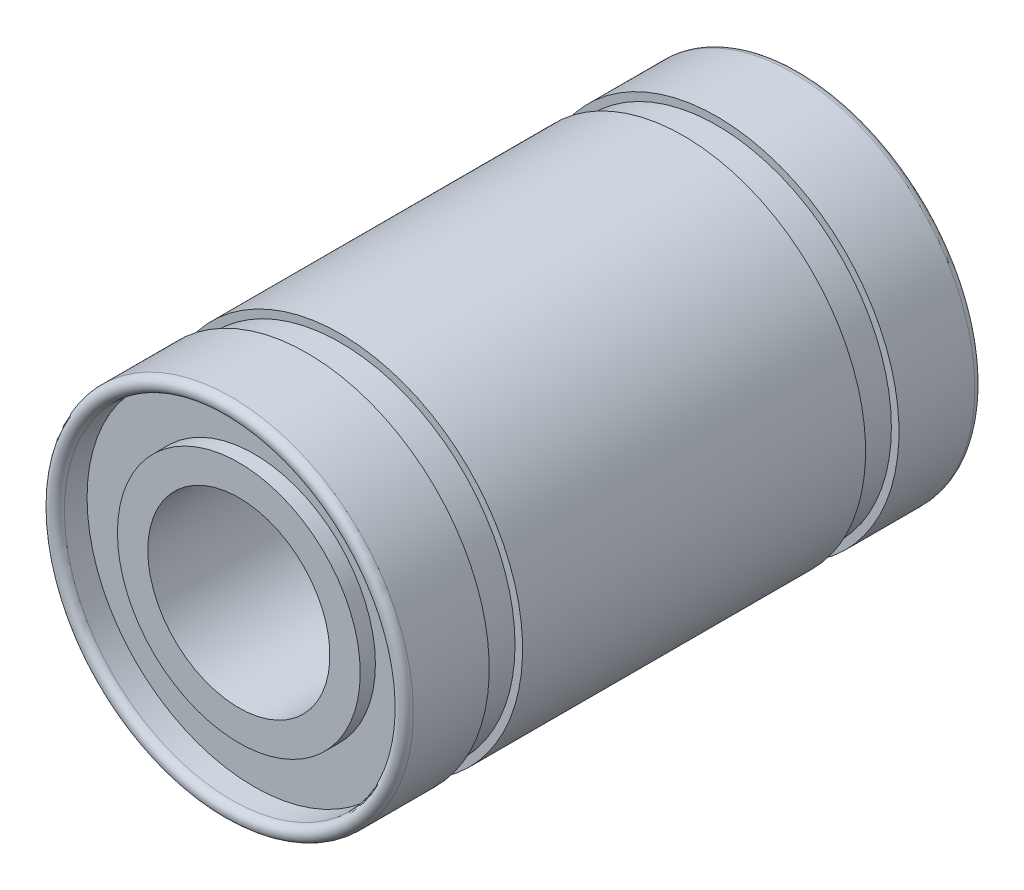
ISO-10303-21;
HEADER;
FILE_DESCRIPTION(('STEP AP214'),'2;1');
FILE_NAME('part.step','',(''),(''),'','','');
FILE_SCHEMA(('AUTOMOTIVE_DESIGN { 1 0 10303 214 1 1 1 1 }'));
ENDSEC;
DATA;
#1=APPLICATION_CONTEXT('core data for automotive mechanical design processes');
#2=APPLICATION_PROTOCOL_DEFINITION('international standard','automotive_design',2000,#1);
#3=PRODUCT_CONTEXT('',#1,'mechanical');
#4=PRODUCT('Part','Part','',(#3));
#5=PRODUCT_RELATED_PRODUCT_CATEGORY('part','',(#4));
#6=PRODUCT_DEFINITION_FORMATION('','',#4);
#7=PRODUCT_DEFINITION_CONTEXT('part definition',#1,'design');
#8=PRODUCT_DEFINITION('design','',#6,#7);
#9=PRODUCT_DEFINITION_SHAPE('','',#8);
#10=(LENGTH_UNIT() NAMED_UNIT(*) SI_UNIT(.MILLI.,.METRE.));
#11=(NAMED_UNIT(*) PLANE_ANGLE_UNIT() SI_UNIT($,.RADIAN.));
#12=(NAMED_UNIT(*) SI_UNIT($,.STERADIAN.) SOLID_ANGLE_UNIT());
#13=UNCERTAINTY_MEASURE_WITH_UNIT(LENGTH_MEASURE(1.E-05),#10,'distance_accuracy_value','');
#14=(GEOMETRIC_REPRESENTATION_CONTEXT(3) GLOBAL_UNCERTAINTY_ASSIGNED_CONTEXT((#13)) GLOBAL_UNIT_ASSIGNED_CONTEXT((#10,
#11,#12)) REPRESENTATION_CONTEXT('',''));
#15=CARTESIAN_POINT('',(0.,0.,0.));
#16=DIRECTION('',(0.,0.,1.));
#17=DIRECTION('',(1.,0.,0.));
#18=AXIS2_PLACEMENT_3D('',#15,#16,#17);
#19=CARTESIAN_POINT('',(0.,0.,18.5));
#20=DIRECTION('',(0.,0.,-1.));
#21=DIRECTION('',(-1.,0.,0.));
#22=AXIS2_PLACEMENT_3D('',#19,#20,#21);
#23=CYLINDRICAL_SURFACE('',#22,3.);
#24=CARTESIAN_POINT('',(0.,0.,0.5));
#25=DIRECTION('',(0.,0.,-1.));
#26=DIRECTION('',(-1.,0.,0.));
#27=AXIS2_PLACEMENT_3D('',#24,#25,#26);
#28=CIRCLE('',#27,3.);
#29=CARTESIAN_POINT('',(-3.,0.,0.5));
#30=VERTEX_POINT('',#29);
#31=EDGE_CURVE('E68',#30,#30,#28,.T.);
#32=ORIENTED_EDGE('',*,*,#31,.T.);
#33=EDGE_LOOP('',(#32));
#34=FACE_BOUND('',#33,.T.);
#35=CARTESIAN_POINT('',(0.,0.,18.5));
#36=DIRECTION('',(0.,0.,-1.));
#37=DIRECTION('',(-1.,0.,0.));
#38=AXIS2_PLACEMENT_3D('',#35,#36,#37);
#39=CIRCLE('',#38,3.);
#40=CARTESIAN_POINT('',(-3.,0.,18.5));
#41=VERTEX_POINT('',#40);
#42=EDGE_CURVE('E18',#41,#41,#39,.T.);
#43=ORIENTED_EDGE('',*,*,#42,.F.);
#44=EDGE_LOOP('',(#43));
#45=FACE_BOUND('',#44,.T.);
#46=ADVANCED_FACE('F15',(#34,#45),#23,.F.);
#47=CARTESIAN_POINT('',(0.,0.,18.5));
#48=DIRECTION('',(0.,0.,1.));
#49=DIRECTION('',(1.,0.,0.));
#50=AXIS2_PLACEMENT_3D('',#47,#48,#49);
#51=PLANE('',#50);
#52=CARTESIAN_POINT('',(0.,0.,18.5));
#53=DIRECTION('',(0.,0.,-1.));
#54=DIRECTION('',(-1.,0.,0.));
#55=AXIS2_PLACEMENT_3D('',#52,#53,#54);
#56=CIRCLE('',#55,4.);
#57=CARTESIAN_POINT('',(-4.,0.,18.5));
#58=VERTEX_POINT('',#57);
#59=EDGE_CURVE('E66',#58,#58,#56,.T.);
#60=ORIENTED_EDGE('',*,*,#59,.F.);
#61=EDGE_LOOP('',(#60));
#62=FACE_BOUND('',#61,.T.);
#63=ORIENTED_EDGE('',*,*,#42,.T.);
#64=EDGE_LOOP('',(#63));
#65=FACE_BOUND('',#64,.T.);
#66=ADVANCED_FACE('F75',(#62,#65),#51,.T.);
#67=CARTESIAN_POINT('',(0.,0.,0.5));
#68=DIRECTION('',(0.,0.,1.));
#69=DIRECTION('',(1.,0.,0.));
#70=AXIS2_PLACEMENT_3D('',#67,#68,#69);
#71=PLANE('',#70);
#72=CARTESIAN_POINT('',(0.,0.,0.5));
#73=DIRECTION('',(0.,0.,-1.));
#74=DIRECTION('',(-1.,0.,0.));
#75=AXIS2_PLACEMENT_3D('',#72,#73,#74);
#76=CIRCLE('',#75,4.);
#77=CARTESIAN_POINT('',(-4.,0.,0.5));
#78=VERTEX_POINT('',#77);
#79=EDGE_CURVE('E63',#78,#78,#76,.F.);
#80=ORIENTED_EDGE('',*,*,#79,.F.);
#81=EDGE_LOOP('',(#80));
#82=FACE_BOUND('',#81,.T.);
#83=ORIENTED_EDGE('',*,*,#31,.F.);
#84=EDGE_LOOP('',(#83));
#85=FACE_BOUND('',#84,.T.);
#86=ADVANCED_FACE('F82',(#82,#85),#71,.F.);
#87=CARTESIAN_POINT('',(0.,0.,18.5));
#88=DIRECTION('',(0.,0.,-1.));
#89=DIRECTION('',(-1.,0.,0.));
#90=AXIS2_PLACEMENT_3D('',#87,#88,#89);
#91=CYLINDRICAL_SURFACE('',#90,4.);
#92=ORIENTED_EDGE('',*,*,#59,.T.);
#93=EDGE_LOOP('',(#92));
#94=FACE_BOUND('',#93,.T.);
#95=CARTESIAN_POINT('',(0.,0.,18.));
#96=DIRECTION('',(0.,0.,-1.));
#97=DIRECTION('',(-1.,0.,0.));
#98=AXIS2_PLACEMENT_3D('',#95,#96,#97);
#99=CIRCLE('',#98,4.);
#100=CARTESIAN_POINT('',(-4.,0.,18.));
#101=VERTEX_POINT('',#100);
#102=EDGE_CURVE('E60',#101,#101,#99,.T.);
#103=ORIENTED_EDGE('',*,*,#102,.F.);
#104=EDGE_LOOP('',(#103));
#105=FACE_BOUND('',#104,.T.);
#106=ADVANCED_FACE('F166',(#94,#105),#91,.T.);
#107=CARTESIAN_POINT('',(0.,0.,18.5));
#108=DIRECTION('',(0.,0.,-1.));
#109=DIRECTION('',(-1.,0.,0.));
#110=AXIS2_PLACEMENT_3D('',#107,#108,#109);
#111=CYLINDRICAL_SURFACE('',#110,4.);
#112=CARTESIAN_POINT('',(0.,0.,1.));
#113=DIRECTION('',(0.,0.,-1.));
#114=DIRECTION('',(-1.,0.,0.));
#115=AXIS2_PLACEMENT_3D('',#112,#113,#114);
#116=CIRCLE('',#115,4.);
#117=CARTESIAN_POINT('',(-4.,0.,1.));
#118=VERTEX_POINT('',#117);
#119=EDGE_CURVE('E57',#118,#118,#116,.T.);
#120=ORIENTED_EDGE('',*,*,#119,.T.);
#121=EDGE_LOOP('',(#120));
#122=FACE_BOUND('',#121,.T.);
#123=ORIENTED_EDGE('',*,*,#79,.T.);
#124=EDGE_LOOP('',(#123));
#125=FACE_BOUND('',#124,.T.);
#126=ADVANCED_FACE('F162',(#122,#125),#111,.T.);
#127=CARTESIAN_POINT('',(0.,0.,18.));
#128=DIRECTION('',(0.,0.,1.));
#129=DIRECTION('',(1.,0.,0.));
#130=AXIS2_PLACEMENT_3D('',#127,#128,#129);
#131=PLANE('',#130);
#132=CARTESIAN_POINT('',(0.,0.,18.));
#133=DIRECTION('',(0.,0.,-1.));
#134=DIRECTION('',(-1.,0.,0.));
#135=AXIS2_PLACEMENT_3D('',#132,#133,#134);
#136=CIRCLE('',#135,5.5);
#137=CARTESIAN_POINT('',(-5.5,0.,18.));
#138=VERTEX_POINT('',#137);
#139=EDGE_CURVE('E54',#138,#138,#136,.F.);
#140=ORIENTED_EDGE('',*,*,#139,.T.);
#141=EDGE_LOOP('',(#140));
#142=FACE_BOUND('',#141,.T.);
#143=ORIENTED_EDGE('',*,*,#102,.T.);
#144=EDGE_LOOP('',(#143));
#145=FACE_BOUND('',#144,.T.);
#146=ADVANCED_FACE('F155',(#142,#145),#131,.T.);
#147=CARTESIAN_POINT('',(0.,0.,1.));
#148=DIRECTION('',(0.,0.,1.));
#149=DIRECTION('',(1.,0.,0.));
#150=AXIS2_PLACEMENT_3D('',#147,#148,#149);
#151=PLANE('',#150);
#152=CARTESIAN_POINT('',(0.,0.,1.));
#153=DIRECTION('',(0.,0.,-1.));
#154=DIRECTION('',(-1.,0.,0.));
#155=AXIS2_PLACEMENT_3D('',#152,#153,#154);
#156=CIRCLE('',#155,5.5);
#157=CARTESIAN_POINT('',(-5.5,0.,1.));
#158=VERTEX_POINT('',#157);
#159=EDGE_CURVE('E51',#158,#158,#156,.T.);
#160=ORIENTED_EDGE('',*,*,#159,.T.);
#161=EDGE_LOOP('',(#160));
#162=FACE_BOUND('',#161,.T.);
#163=ORIENTED_EDGE('',*,*,#119,.F.);
#164=EDGE_LOOP('',(#163));
#165=FACE_BOUND('',#164,.T.);
#166=ADVANCED_FACE('F147',(#162,#165),#151,.F.);
#167=CARTESIAN_POINT('',(0.,0.,19.));
#168=DIRECTION('',(0.,0.,-1.));
#169=DIRECTION('',(-1.,0.,0.));
#170=AXIS2_PLACEMENT_3D('',#167,#168,#169);
#171=CYLINDRICAL_SURFACE('',#170,5.5);
#172=ORIENTED_EDGE('',*,*,#139,.F.);
#173=EDGE_LOOP('',(#172));
#174=FACE_BOUND('',#173,.T.);
#175=CARTESIAN_POINT('',(0.,0.,18.75));
#176=DIRECTION('',(0.,0.,1.));
#177=DIRECTION('',(1.,0.,0.));
#178=AXIS2_PLACEMENT_3D('',#175,#176,#177);
#179=CIRCLE('',#178,5.5);
#180=CARTESIAN_POINT('',(5.5,0.,18.75));
#181=VERTEX_POINT('',#180);
#182=EDGE_CURVE('E30',#181,#181,#179,.F.);
#183=ORIENTED_EDGE('',*,*,#182,.F.);
#184=EDGE_LOOP('',(#183));
#185=FACE_BOUND('',#184,.T.);
#186=ADVANCED_FACE('F144',(#174,#185),#171,.F.);
#187=CARTESIAN_POINT('',(0.,0.,19.));
#188=DIRECTION('',(0.,0.,-1.));
#189=DIRECTION('',(-1.,0.,0.));
#190=AXIS2_PLACEMENT_3D('',#187,#188,#189);
#191=CYLINDRICAL_SURFACE('',#190,5.5);
#192=CARTESIAN_POINT('',(0.,0.,0.25));
#193=DIRECTION('',(0.,0.,1.));
#194=DIRECTION('',(1.,0.,0.));
#195=AXIS2_PLACEMENT_3D('',#192,#193,#194);
#196=CIRCLE('',#195,5.5);
#197=CARTESIAN_POINT('',(5.5,0.,0.25));
#198=VERTEX_POINT('',#197);
#199=EDGE_CURVE('E136',#198,#198,#196,.T.);
#200=ORIENTED_EDGE('',*,*,#199,.F.);
#201=EDGE_LOOP('',(#200));
#202=FACE_BOUND('',#201,.T.);
#203=ORIENTED_EDGE('',*,*,#159,.F.);
#204=EDGE_LOOP('',(#203));
#205=FACE_BOUND('',#204,.T.);
#206=ADVANCED_FACE('F146',(#202,#205),#191,.F.);
#207=CARTESIAN_POINT('',(0.,0.,18.75));
#208=DIRECTION('',(0.,0.,1.));
#209=DIRECTION('',(1.,0.,0.));
#210=AXIS2_PLACEMENT_3D('',#207,#208,#209);
#211=TOROIDAL_SURFACE('',#210,5.75,0.25);
#212=CARTESIAN_POINT('',(0.,0.,18.75));
#213=DIRECTION('',(0.,0.,-1.));
#214=DIRECTION('',(-1.,0.,0.));
#215=AXIS2_PLACEMENT_3D('',#212,#213,#214);
#216=CIRCLE('',#215,6.);
#217=CARTESIAN_POINT('',(-6.,0.,18.75));
#218=VERTEX_POINT('',#217);
#219=EDGE_CURVE('E133',#218,#218,#216,.T.);
#220=ORIENTED_EDGE('',*,*,#219,.F.);
#221=EDGE_LOOP('',(#220));
#222=FACE_BOUND('',#221,.T.);
#223=ORIENTED_EDGE('',*,*,#182,.T.);
#224=EDGE_LOOP('',(#223));
#225=FACE_BOUND('',#224,.T.);
#226=ADVANCED_FACE('F127',(#222,#225),#211,.T.);
#227=CARTESIAN_POINT('',(0.,0.,0.25));
#228=DIRECTION('',(0.,0.,1.));
#229=DIRECTION('',(1.,0.,0.));
#230=AXIS2_PLACEMENT_3D('',#227,#228,#229);
#231=TOROIDAL_SURFACE('',#230,5.75,0.25);
#232=ORIENTED_EDGE('',*,*,#199,.T.);
#233=EDGE_LOOP('',(#232));
#234=FACE_BOUND('',#233,.T.);
#235=CARTESIAN_POINT('',(0.,0.,0.25));
#236=DIRECTION('',(0.,0.,-1.));
#237=DIRECTION('',(-1.,0.,0.));
#238=AXIS2_PLACEMENT_3D('',#235,#236,#237);
#239=CIRCLE('',#238,6.);
#240=CARTESIAN_POINT('',(-6.,0.,0.25));
#241=VERTEX_POINT('',#240);
#242=EDGE_CURVE('E50',#241,#241,#239,.F.);
#243=ORIENTED_EDGE('',*,*,#242,.F.);
#244=EDGE_LOOP('',(#243));
#245=FACE_BOUND('',#244,.T.);
#246=ADVANCED_FACE('F122',(#234,#245),#231,.T.);
#247=CARTESIAN_POINT('',(0.,0.,19.));
#248=DIRECTION('',(0.,0.,-1.));
#249=DIRECTION('',(-1.,0.,0.));
#250=AXIS2_PLACEMENT_3D('',#247,#248,#249);
#251=CYLINDRICAL_SURFACE('',#250,6.);
#252=ORIENTED_EDGE('',*,*,#219,.T.);
#253=EDGE_LOOP('',(#252));
#254=FACE_BOUND('',#253,.T.);
#255=CARTESIAN_POINT('',(0.,0.,16.25));
#256=DIRECTION('',(0.,0.,-1.));
#257=DIRECTION('',(-1.,0.,0.));
#258=AXIS2_PLACEMENT_3D('',#255,#256,#257);
#259=CIRCLE('',#258,6.);
#260=CARTESIAN_POINT('',(-6.,0.,16.25));
#261=VERTEX_POINT('',#260);
#262=EDGE_CURVE('E47',#261,#261,#259,.F.);
#263=ORIENTED_EDGE('',*,*,#262,.T.);
#264=EDGE_LOOP('',(#263));
#265=FACE_BOUND('',#264,.T.);
#266=ADVANCED_FACE('F118',(#254,#265),#251,.T.);
#267=CARTESIAN_POINT('',(0.,0.,19.));
#268=DIRECTION('',(0.,0.,-1.));
#269=DIRECTION('',(-1.,0.,0.));
#270=AXIS2_PLACEMENT_3D('',#267,#268,#269);
#271=CYLINDRICAL_SURFACE('',#270,6.);
#272=CARTESIAN_POINT('',(0.,0.,2.75));
#273=DIRECTION('',(0.,0.,-1.));
#274=DIRECTION('',(-1.,0.,0.));
#275=AXIS2_PLACEMENT_3D('',#272,#273,#274);
#276=CIRCLE('',#275,6.);
#277=CARTESIAN_POINT('',(-6.,0.,2.75));
#278=VERTEX_POINT('',#277);
#279=EDGE_CURVE('E44',#278,#278,#276,.F.);
#280=ORIENTED_EDGE('',*,*,#279,.F.);
#281=EDGE_LOOP('',(#280));
#282=FACE_BOUND('',#281,.T.);
#283=ORIENTED_EDGE('',*,*,#242,.T.);
#284=EDGE_LOOP('',(#283));
#285=FACE_BOUND('',#284,.T.);
#286=ADVANCED_FACE('F114',(#282,#285),#271,.T.);
#287=CARTESIAN_POINT('',(0.,0.,16.25));
#288=DIRECTION('',(0.,0.,1.));
#289=DIRECTION('',(1.,0.,0.));
#290=AXIS2_PLACEMENT_3D('',#287,#288,#289);
#291=PLANE('',#290);
#292=ORIENTED_EDGE('',*,*,#262,.F.);
#293=EDGE_LOOP('',(#292));
#294=FACE_BOUND('',#293,.T.);
#295=CARTESIAN_POINT('',(0.,0.,16.25));
#296=DIRECTION('',(0.,0.,-1.));
#297=DIRECTION('',(-1.,0.,0.));
#298=AXIS2_PLACEMENT_3D('',#295,#296,#297);
#299=CIRCLE('',#298,5.75);
#300=CARTESIAN_POINT('',(-5.75,0.,16.25));
#301=VERTEX_POINT('',#300);
#302=EDGE_CURVE('E41',#301,#301,#299,.T.);
#303=ORIENTED_EDGE('',*,*,#302,.F.);
#304=EDGE_LOOP('',(#303));
#305=FACE_BOUND('',#304,.T.);
#306=ADVANCED_FACE('F110',(#294,#305),#291,.F.);
#307=CARTESIAN_POINT('',(0.,0.,2.75));
#308=DIRECTION('',(0.,0.,1.));
#309=DIRECTION('',(1.,0.,0.));
#310=AXIS2_PLACEMENT_3D('',#307,#308,#309);
#311=PLANE('',#310);
#312=ORIENTED_EDGE('',*,*,#279,.T.);
#313=EDGE_LOOP('',(#312));
#314=FACE_BOUND('',#313,.T.);
#315=CARTESIAN_POINT('',(0.,0.,2.75));
#316=DIRECTION('',(0.,0.,-1.));
#317=DIRECTION('',(-1.,0.,0.));
#318=AXIS2_PLACEMENT_3D('',#315,#316,#317);
#319=CIRCLE('',#318,5.75);
#320=CARTESIAN_POINT('',(-5.75,0.,2.75));
#321=VERTEX_POINT('',#320);
#322=EDGE_CURVE('E38',#321,#321,#319,.F.);
#323=ORIENTED_EDGE('',*,*,#322,.F.);
#324=EDGE_LOOP('',(#323));
#325=FACE_BOUND('',#324,.T.);
#326=ADVANCED_FACE('F106',(#314,#325),#311,.T.);
#327=CARTESIAN_POINT('',(0.,0.,18.5));
#328=DIRECTION('',(0.,0.,-1.));
#329=DIRECTION('',(-1.,0.,0.));
#330=AXIS2_PLACEMENT_3D('',#327,#328,#329);
#331=CYLINDRICAL_SURFACE('',#330,5.75);
#332=ORIENTED_EDGE('',*,*,#302,.T.);
#333=EDGE_LOOP('',(#332));
#334=FACE_BOUND('',#333,.T.);
#335=CARTESIAN_POINT('',(0.,0.,15.15));
#336=DIRECTION('',(0.,0.,-1.));
#337=DIRECTION('',(-1.,0.,0.));
#338=AXIS2_PLACEMENT_3D('',#335,#336,#337);
#339=CIRCLE('',#338,5.75);
#340=CARTESIAN_POINT('',(-5.75,0.,15.15));
#341=VERTEX_POINT('',#340);
#342=EDGE_CURVE('E35',#341,#341,#339,.T.);
#343=ORIENTED_EDGE('',*,*,#342,.F.);
#344=EDGE_LOOP('',(#343));
#345=FACE_BOUND('',#344,.T.);
#346=ADVANCED_FACE('F102',(#334,#345),#331,.T.);
#347=CARTESIAN_POINT('',(0.,0.,18.5));
#348=DIRECTION('',(0.,0.,-1.));
#349=DIRECTION('',(-1.,0.,0.));
#350=AXIS2_PLACEMENT_3D('',#347,#348,#349);
#351=CYLINDRICAL_SURFACE('',#350,5.75);
#352=CARTESIAN_POINT('',(0.,0.,3.85));
#353=DIRECTION('',(0.,0.,-1.));
#354=DIRECTION('',(-1.,0.,0.));
#355=AXIS2_PLACEMENT_3D('',#352,#353,#354);
#356=CIRCLE('',#355,5.75);
#357=CARTESIAN_POINT('',(-5.75,0.,3.85));
#358=VERTEX_POINT('',#357);
#359=EDGE_CURVE('E27',#358,#358,#356,.T.);
#360=ORIENTED_EDGE('',*,*,#359,.T.);
#361=EDGE_LOOP('',(#360));
#362=FACE_BOUND('',#361,.T.);
#363=ORIENTED_EDGE('',*,*,#322,.T.);
#364=EDGE_LOOP('',(#363));
#365=FACE_BOUND('',#364,.T.);
#366=ADVANCED_FACE('F98',(#362,#365),#351,.T.);
#367=CARTESIAN_POINT('',(0.,0.,15.15));
#368=DIRECTION('',(0.,0.,1.));
#369=DIRECTION('',(1.,0.,0.));
#370=AXIS2_PLACEMENT_3D('',#367,#368,#369);
#371=PLANE('',#370);
#372=CARTESIAN_POINT('',(0.,0.,15.15));
#373=DIRECTION('',(0.,0.,-1.));
#374=DIRECTION('',(-1.,0.,0.));
#375=AXIS2_PLACEMENT_3D('',#372,#373,#374);
#376=CIRCLE('',#375,6.);
#377=CARTESIAN_POINT('',(-6.,0.,15.15));
#378=VERTEX_POINT('',#377);
#379=EDGE_CURVE('E22',#378,#378,#376,.T.);
#380=ORIENTED_EDGE('',*,*,#379,.F.);
#381=EDGE_LOOP('',(#380));
#382=FACE_BOUND('',#381,.T.);
#383=ORIENTED_EDGE('',*,*,#342,.T.);
#384=EDGE_LOOP('',(#383));
#385=FACE_BOUND('',#384,.T.);
#386=ADVANCED_FACE('F92',(#382,#385),#371,.T.);
#387=CARTESIAN_POINT('',(0.,0.,3.85));
#388=DIRECTION('',(0.,0.,1.));
#389=DIRECTION('',(1.,0.,0.));
#390=AXIS2_PLACEMENT_3D('',#387,#388,#389);
#391=PLANE('',#390);
#392=CARTESIAN_POINT('',(0.,0.,3.85));
#393=DIRECTION('',(0.,0.,-1.));
#394=DIRECTION('',(-1.,0.,0.));
#395=AXIS2_PLACEMENT_3D('',#392,#393,#394);
#396=CIRCLE('',#395,6.);
#397=CARTESIAN_POINT('',(-6.,0.,3.85));
#398=VERTEX_POINT('',#397);
#399=EDGE_CURVE('E10',#398,#398,#396,.F.);
#400=ORIENTED_EDGE('',*,*,#399,.F.);
#401=EDGE_LOOP('',(#400));
#402=FACE_BOUND('',#401,.T.);
#403=ORIENTED_EDGE('',*,*,#359,.F.);
#404=EDGE_LOOP('',(#403));
#405=FACE_BOUND('',#404,.T.);
#406=ADVANCED_FACE('F86',(#402,#405),#391,.F.);
#407=CARTESIAN_POINT('',(0.,0.,19.));
#408=DIRECTION('',(0.,0.,-1.));
#409=DIRECTION('',(-1.,0.,0.));
#410=AXIS2_PLACEMENT_3D('',#407,#408,#409);
#411=CYLINDRICAL_SURFACE('',#410,6.);
#412=ORIENTED_EDGE('',*,*,#379,.T.);
#413=EDGE_LOOP('',(#412));
#414=FACE_BOUND('',#413,.T.);
#415=ORIENTED_EDGE('',*,*,#399,.T.);
#416=EDGE_LOOP('',(#415));
#417=FACE_BOUND('',#416,.T.);
#418=ADVANCED_FACE('F84',(#414,#417),#411,.T.);
#419=CLOSED_SHELL('',(#46,#66,#86,#106,#126,#146,#166,#186,#206,#226,#246,#266,#286,#306,#326,
#346,#366,#386,#406,#418));
#420=MANIFOLD_SOLID_BREP('B1',#419);
#421=ADVANCED_BREP_SHAPE_REPRESENTATION('',(#18,#420),#14);
#422=SHAPE_DEFINITION_REPRESENTATION(#9,#421);
ENDSEC;
END-ISO-10303-21;
